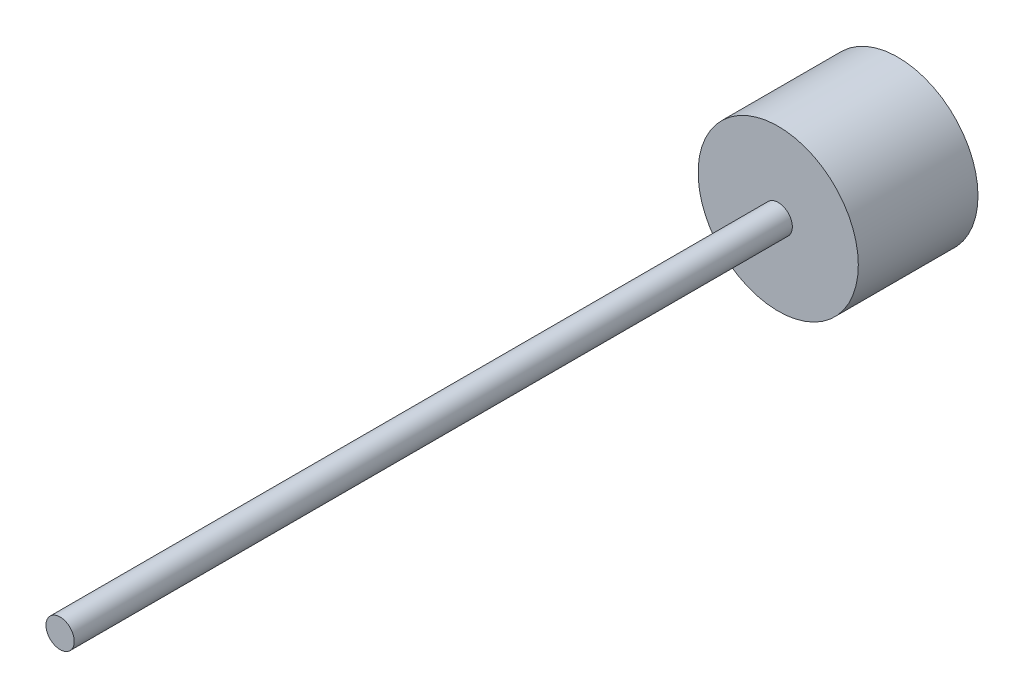
ISO-10303-21;
HEADER;
FILE_DESCRIPTION(('STEP AP214'),'2;1');
FILE_NAME('part.step','',(''),(''),'','','');
FILE_SCHEMA(('AUTOMOTIVE_DESIGN { 1 0 10303 214 1 1 1 1 }'));
ENDSEC;
DATA;
#1=APPLICATION_CONTEXT('core data for automotive mechanical design processes');
#2=APPLICATION_PROTOCOL_DEFINITION('international standard','automotive_design',2000,#1);
#3=PRODUCT_CONTEXT('',#1,'mechanical');
#4=PRODUCT('Part','Part','',(#3));
#5=PRODUCT_RELATED_PRODUCT_CATEGORY('part','',(#4));
#6=PRODUCT_DEFINITION_FORMATION('','',#4);
#7=PRODUCT_DEFINITION_CONTEXT('part definition',#1,'design');
#8=PRODUCT_DEFINITION('design','',#6,#7);
#9=PRODUCT_DEFINITION_SHAPE('','',#8);
#10=(LENGTH_UNIT() NAMED_UNIT(*) SI_UNIT(.MILLI.,.METRE.));
#11=(NAMED_UNIT(*) PLANE_ANGLE_UNIT() SI_UNIT($,.RADIAN.));
#12=(NAMED_UNIT(*) SI_UNIT($,.STERADIAN.) SOLID_ANGLE_UNIT());
#13=UNCERTAINTY_MEASURE_WITH_UNIT(LENGTH_MEASURE(1.E-05),#10,'distance_accuracy_value','');
#14=(GEOMETRIC_REPRESENTATION_CONTEXT(3) GLOBAL_UNCERTAINTY_ASSIGNED_CONTEXT((#13)) GLOBAL_UNIT_ASSIGNED_CONTEXT((#10,
#11,#12)) REPRESENTATION_CONTEXT('',''));
#15=CARTESIAN_POINT('',(0.,0.,0.));
#16=DIRECTION('',(0.,0.,1.));
#17=DIRECTION('',(1.,0.,0.));
#18=AXIS2_PLACEMENT_3D('',#15,#16,#17);
#19=CARTESIAN_POINT('',(0.,0.,12.7));
#20=DIRECTION('',(0.,0.,1.));
#21=DIRECTION('',(1.,0.,0.));
#22=AXIS2_PLACEMENT_3D('',#19,#20,#21);
#23=PLANE('',#22);
#24=CARTESIAN_POINT('',(0.,0.,12.7));
#25=DIRECTION('',(0.,0.,1.));
#26=DIRECTION('',(1.,0.,0.));
#27=AXIS2_PLACEMENT_3D('',#24,#25,#26);
#28=CIRCLE('',#27,8.5);
#29=CARTESIAN_POINT('',(8.5,0.,12.7));
#30=VERTEX_POINT('',#29);
#31=EDGE_CURVE('E10',#30,#30,#28,.T.);
#32=ORIENTED_EDGE('',*,*,#31,.T.);
#33=EDGE_LOOP('',(#32));
#34=FACE_BOUND('',#33,.T.);
#35=CARTESIAN_POINT('',(0.,0.,12.7));
#36=DIRECTION('',(0.,0.,1.));
#37=DIRECTION('',(1.,0.,0.));
#38=AXIS2_PLACEMENT_3D('',#35,#36,#37);
#39=CIRCLE('',#38,1.499997);
#40=CARTESIAN_POINT('',(1.499997,0.,12.7));
#41=VERTEX_POINT('',#40);
#42=EDGE_CURVE('E42',#41,#41,#39,.T.);
#43=ORIENTED_EDGE('',*,*,#42,.F.);
#44=EDGE_LOOP('',(#43));
#45=FACE_BOUND('',#44,.T.);
#46=ADVANCED_FACE('F31',(#34,#45),#23,.T.);
#47=CARTESIAN_POINT('',(0.,0.,0.));
#48=DIRECTION('',(0.,0.,1.));
#49=DIRECTION('',(1.,0.,0.));
#50=AXIS2_PLACEMENT_3D('',#47,#48,#49);
#51=PLANE('',#50);
#52=CARTESIAN_POINT('',(0.,0.,0.));
#53=DIRECTION('',(0.,0.,1.));
#54=DIRECTION('',(1.,0.,0.));
#55=AXIS2_PLACEMENT_3D('',#52,#53,#54);
#56=CIRCLE('',#55,8.5);
#57=CARTESIAN_POINT('',(8.5,0.,0.));
#58=VERTEX_POINT('',#57);
#59=EDGE_CURVE('E35',#58,#58,#56,.T.);
#60=ORIENTED_EDGE('',*,*,#59,.F.);
#61=EDGE_LOOP('',(#60));
#62=FACE_BOUND('',#61,.T.);
#63=ADVANCED_FACE('F61',(#62),#51,.F.);
#64=CARTESIAN_POINT('',(0.,0.,12.7));
#65=DIRECTION('',(0.,0.,-1.));
#66=DIRECTION('',(-1.,0.,0.));
#67=AXIS2_PLACEMENT_3D('',#64,#65,#66);
#68=CYLINDRICAL_SURFACE('',#67,8.5);
#69=ORIENTED_EDGE('',*,*,#31,.F.);
#70=EDGE_LOOP('',(#69));
#71=FACE_BOUND('',#70,.T.);
#72=ORIENTED_EDGE('',*,*,#59,.T.);
#73=EDGE_LOOP('',(#72));
#74=FACE_BOUND('',#73,.T.);
#75=ADVANCED_FACE('F33',(#71,#74),#68,.T.);
#76=CARTESIAN_POINT('',(0.,0.,88.9));
#77=DIRECTION('',(0.,0.,-1.));
#78=DIRECTION('',(-1.,0.,0.));
#79=AXIS2_PLACEMENT_3D('',#76,#77,#78);
#80=CYLINDRICAL_SURFACE('',#79,1.499997);
#81=ORIENTED_EDGE('',*,*,#42,.T.);
#82=EDGE_LOOP('',(#81));
#83=FACE_BOUND('',#82,.T.);
#84=CARTESIAN_POINT('',(0.,0.,88.9));
#85=DIRECTION('',(0.,0.,1.));
#86=DIRECTION('',(1.,0.,0.));
#87=AXIS2_PLACEMENT_3D('',#84,#85,#86);
#88=CIRCLE('',#87,1.499997);
#89=CARTESIAN_POINT('',(1.499997,0.,88.9));
#90=VERTEX_POINT('',#89);
#91=EDGE_CURVE('E46',#90,#90,#88,.T.);
#92=ORIENTED_EDGE('',*,*,#91,.F.);
#93=EDGE_LOOP('',(#92));
#94=FACE_BOUND('',#93,.T.);
#95=ADVANCED_FACE('F52',(#83,#94),#80,.T.);
#96=CARTESIAN_POINT('',(0.,0.,88.9));
#97=DIRECTION('',(0.,0.,1.));
#98=DIRECTION('',(1.,0.,0.));
#99=AXIS2_PLACEMENT_3D('',#96,#97,#98);
#100=PLANE('',#99);
#101=ORIENTED_EDGE('',*,*,#91,.T.);
#102=EDGE_LOOP('',(#101));
#103=FACE_BOUND('',#102,.T.);
#104=ADVANCED_FACE('F50',(#103),#100,.T.);
#105=CLOSED_SHELL('',(#46,#63,#75,#95,#104));
#106=MANIFOLD_SOLID_BREP('B2',#105);
#107=ADVANCED_BREP_SHAPE_REPRESENTATION('',(#18,#106),#14);
#108=SHAPE_DEFINITION_REPRESENTATION(#9,#107);
ENDSEC;
END-ISO-10303-21;
